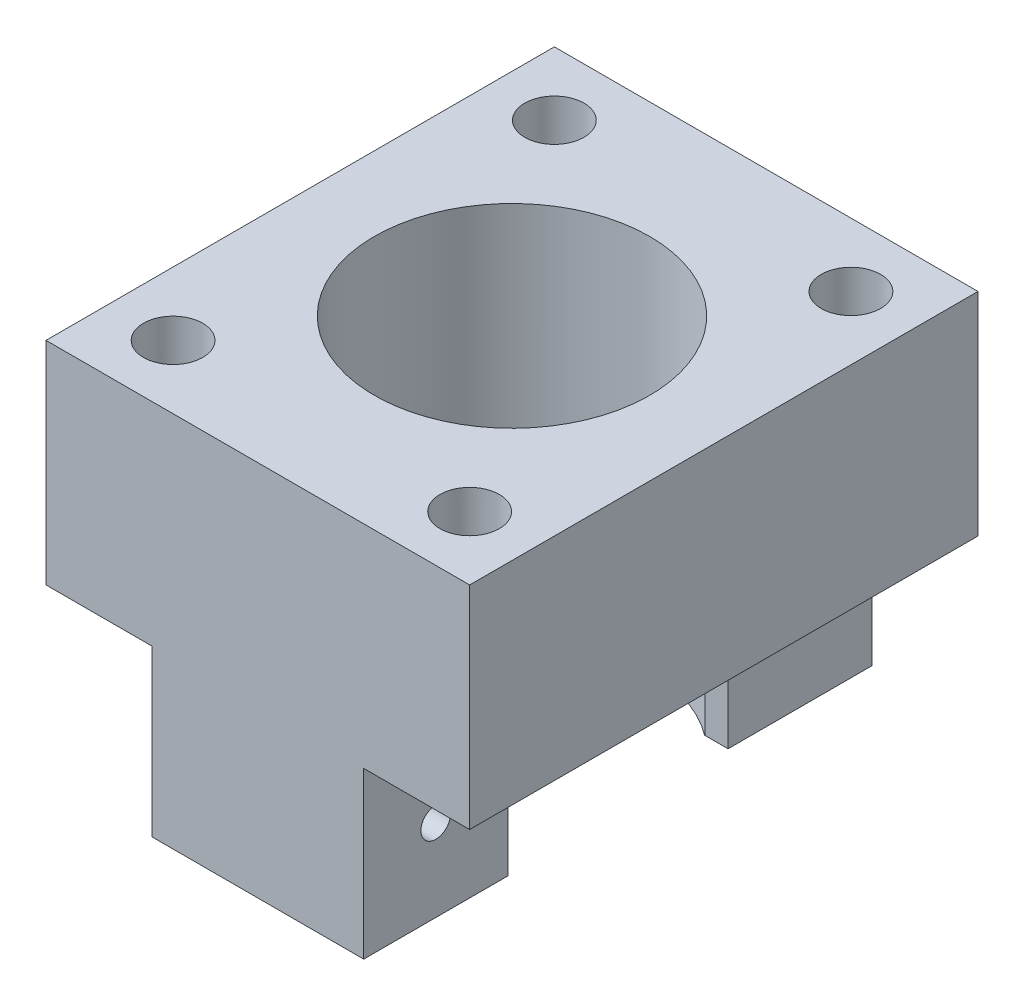
ISO-10303-21;
HEADER;
FILE_DESCRIPTION(('STEP AP214'),'2;1');
FILE_NAME('part.step','',(''),(''),'','','');
FILE_SCHEMA(('AUTOMOTIVE_DESIGN { 1 0 10303 214 1 1 1 1 }'));
ENDSEC;
DATA;
#1=APPLICATION_CONTEXT('core data for automotive mechanical design processes');
#2=APPLICATION_PROTOCOL_DEFINITION('international standard','automotive_design',2000,#1);
#3=PRODUCT_CONTEXT('',#1,'mechanical');
#4=PRODUCT('Part','Part','',(#3));
#5=PRODUCT_RELATED_PRODUCT_CATEGORY('part','',(#4));
#6=PRODUCT_DEFINITION_FORMATION('','',#4);
#7=PRODUCT_DEFINITION_CONTEXT('part definition',#1,'design');
#8=PRODUCT_DEFINITION('design','',#6,#7);
#9=PRODUCT_DEFINITION_SHAPE('','',#8);
#10=(LENGTH_UNIT() NAMED_UNIT(*) SI_UNIT(.MILLI.,.METRE.));
#11=(NAMED_UNIT(*) PLANE_ANGLE_UNIT() SI_UNIT($,.RADIAN.));
#12=(NAMED_UNIT(*) SI_UNIT($,.STERADIAN.) SOLID_ANGLE_UNIT());
#13=UNCERTAINTY_MEASURE_WITH_UNIT(LENGTH_MEASURE(1.E-05),#10,'distance_accuracy_value','');
#14=(GEOMETRIC_REPRESENTATION_CONTEXT(3) GLOBAL_UNCERTAINTY_ASSIGNED_CONTEXT((#13)) GLOBAL_UNIT_ASSIGNED_CONTEXT((#10,
#11,#12)) REPRESENTATION_CONTEXT('',''));
#15=CARTESIAN_POINT('',(0.,0.,0.));
#16=DIRECTION('',(0.,0.,1.));
#17=DIRECTION('',(1.,0.,0.));
#18=AXIS2_PLACEMENT_3D('',#15,#16,#17);
#19=CARTESIAN_POINT('',(0.,0.,0.));
#20=DIRECTION('',(0.,1.,0.));
#21=DIRECTION('',(0.,0.,1.));
#22=AXIS2_PLACEMENT_3D('',#19,#20,#21);
#23=PLANE('',#22);
#24=DIRECTION('',(0.,0.,1.));
#25=VECTOR('',#24,1.);
#26=CARTESIAN_POINT('',(7.5,0.,0.));
#27=LINE('',#26,#25);
#28=CARTESIAN_POINT('',(7.5,0.,0.));
#29=VERTEX_POINT('',#28);
#30=CARTESIAN_POINT('',(7.5,0.,1.5));
#31=VERTEX_POINT('',#30);
#32=EDGE_CURVE('E379',#29,#31,#27,.T.);
#33=ORIENTED_EDGE('',*,*,#32,.F.);
#34=DIRECTION('',(-1.,0.,0.));
#35=VECTOR('',#34,1.);
#36=CARTESIAN_POINT('',(0.,0.,0.));
#37=LINE('',#36,#35);
#38=CARTESIAN_POINT('',(10.,0.,0.));
#39=VERTEX_POINT('',#38);
#40=EDGE_CURVE('E189',#39,#29,#37,.T.);
#41=ORIENTED_EDGE('',*,*,#40,.F.);
#42=DIRECTION('',(0.,0.,-1.));
#43=VECTOR('',#42,1.);
#44=CARTESIAN_POINT('',(10.,0.,0.));
#45=LINE('',#44,#43);
#46=CARTESIAN_POINT('',(10.,0.,12.));
#47=VERTEX_POINT('',#46);
#48=EDGE_CURVE('E292',#47,#39,#45,.T.);
#49=ORIENTED_EDGE('',*,*,#48,.F.);
#50=DIRECTION('',(1.,0.,0.));
#51=VECTOR('',#50,1.);
#52=CARTESIAN_POINT('',(0.,0.,12.));
#53=LINE('',#52,#51);
#54=CARTESIAN_POINT('',(7.5,0.,12.));
#55=VERTEX_POINT('',#54);
#56=EDGE_CURVE('E288',#55,#47,#53,.T.);
#57=ORIENTED_EDGE('',*,*,#56,.F.);
#58=DIRECTION('',(0.,0.,-1.));
#59=VECTOR('',#58,1.);
#60=CARTESIAN_POINT('',(7.5,0.,0.));
#61=LINE('',#60,#59);
#62=CARTESIAN_POINT('',(7.5,0.,10.5));
#63=VERTEX_POINT('',#62);
#64=EDGE_CURVE('E46',#55,#63,#61,.T.);
#65=ORIENTED_EDGE('',*,*,#64,.T.);
#66=CARTESIAN_POINT('',(8.5,0.,10.5));
#67=DIRECTION('',(0.,-1.,0.));
#68=DIRECTION('',(0.,0.,-1.));
#69=AXIS2_PLACEMENT_3D('',#66,#67,#68);
#70=CIRCLE('',#69,1.);
#71=EDGE_CURVE('E235',#63,#63,#70,.T.);
#72=ORIENTED_EDGE('',*,*,#71,.F.);
#73=CARTESIAN_POINT('',(7.5,0.,8.6));
#74=VERTEX_POINT('',#73);
#75=EDGE_CURVE('E12',#63,#74,#61,.T.);
#76=ORIENTED_EDGE('',*,*,#75,.T.);
#77=DIRECTION('',(1.,0.,0.));
#78=VECTOR('',#77,1.);
#79=CARTESIAN_POINT('',(0.,0.,8.6));
#80=LINE('',#79,#78);
#81=CARTESIAN_POINT('',(6.95,0.,8.6));
#82=VERTEX_POINT('',#81);
#83=EDGE_CURVE('E200',#82,#74,#80,.T.);
#84=ORIENTED_EDGE('',*,*,#83,.F.);
#85=CARTESIAN_POINT('',(5.,0.,6.));
#86=DIRECTION('',(0.,-1.,0.));
#87=DIRECTION('',(0.,0.,-1.));
#88=AXIS2_PLACEMENT_3D('',#85,#86,#87);
#89=CIRCLE('',#88,3.25);
#90=CARTESIAN_POINT('',(6.95000000000009,0.,3.40000000000007));
#91=VERTEX_POINT('',#90);
#92=EDGE_CURVE('E263',#91,#82,#89,.T.);
#93=ORIENTED_EDGE('',*,*,#92,.F.);
#94=DIRECTION('',(1.,0.,0.));
#95=VECTOR('',#94,1.);
#96=CARTESIAN_POINT('',(2.2291196666302E-13,0.,3.39999999999989));
#97=LINE('',#96,#95);
#98=CARTESIAN_POINT('',(7.5,0.,3.39999999999989));
#99=VERTEX_POINT('',#98);
#100=EDGE_CURVE('E53',#91,#99,#97,.T.);
#101=ORIENTED_EDGE('',*,*,#100,.T.);
#102=EDGE_CURVE('E381',#31,#99,#27,.T.);
#103=ORIENTED_EDGE('',*,*,#102,.F.);
#104=CARTESIAN_POINT('',(8.5,0.,1.5));
#105=DIRECTION('',(0.,-1.,0.));
#106=DIRECTION('',(0.,0.,-1.));
#107=AXIS2_PLACEMENT_3D('',#104,#105,#106);
#108=CIRCLE('',#107,1.);
#109=EDGE_CURVE('E236',#31,#31,#108,.T.);
#110=ORIENTED_EDGE('',*,*,#109,.F.);
#111=EDGE_LOOP('',(#33,#41,#49,#57,#65,#72,#76,#84,#93,#101,#103,#110));
#112=FACE_BOUND('',#111,.T.);
#113=ADVANCED_FACE('F35',(#112),#23,.F.);
#114=CARTESIAN_POINT('',(0.,5.,0.));
#115=DIRECTION('',(1.,0.,0.));
#116=DIRECTION('',(0.,0.,-1.));
#117=AXIS2_PLACEMENT_3D('',#114,#115,#116);
#118=PLANE('',#117);
#119=DIRECTION('',(0.,0.,1.));
#120=VECTOR('',#119,1.);
#121=CARTESIAN_POINT('',(0.,0.,0.));
#122=LINE('',#121,#120);
#123=CARTESIAN_POINT('',(0.,0.,0.));
#124=VERTEX_POINT('',#123);
#125=CARTESIAN_POINT('',(0.,0.,12.));
#126=VERTEX_POINT('',#125);
#127=EDGE_CURVE('E275',#124,#126,#122,.T.);
#128=ORIENTED_EDGE('',*,*,#127,.T.);
#129=DIRECTION('',(0.,-1.,0.));
#130=VECTOR('',#129,1.);
#131=CARTESIAN_POINT('',(0.,5.,12.));
#132=LINE('',#131,#130);
#133=CARTESIAN_POINT('',(0.,5.,12.));
#134=VERTEX_POINT('',#133);
#135=EDGE_CURVE('E303',#134,#126,#132,.T.);
#136=ORIENTED_EDGE('',*,*,#135,.F.);
#137=DIRECTION('',(0.,0.,1.));
#138=VECTOR('',#137,1.);
#139=CARTESIAN_POINT('',(0.,5.,0.));
#140=LINE('',#139,#138);
#141=CARTESIAN_POINT('',(0.,5.,0.));
#142=VERTEX_POINT('',#141);
#143=EDGE_CURVE('E276',#142,#134,#140,.T.);
#144=ORIENTED_EDGE('',*,*,#143,.F.);
#145=DIRECTION('',(0.,-1.,0.));
#146=VECTOR('',#145,1.);
#147=CARTESIAN_POINT('',(0.,5.,0.));
#148=LINE('',#147,#146);
#149=EDGE_CURVE('E285',#142,#124,#148,.T.);
#150=ORIENTED_EDGE('',*,*,#149,.T.);
#151=EDGE_LOOP('',(#128,#136,#144,#150));
#152=FACE_BOUND('',#151,.T.);
#153=ADVANCED_FACE('F37',(#152),#118,.F.);
#154=CARTESIAN_POINT('',(0.,5.,12.));
#155=DIRECTION('',(0.,0.,-1.));
#156=DIRECTION('',(-1.,0.,0.));
#157=AXIS2_PLACEMENT_3D('',#154,#155,#156);
#158=PLANE('',#157);
#159=CARTESIAN_POINT('',(2.50000000000004,0.,12.));
#160=VERTEX_POINT('',#159);
#161=EDGE_CURVE('E289',#126,#160,#53,.T.);
#162=ORIENTED_EDGE('',*,*,#161,.T.);
#163=DIRECTION('',(0.,1.,0.));
#164=VECTOR('',#163,1.);
#165=CARTESIAN_POINT('',(2.50000000000004,-3.9,12.));
#166=LINE('',#165,#164);
#167=CARTESIAN_POINT('',(2.50000000000004,-3.9,12.));
#168=VERTEX_POINT('',#167);
#169=EDGE_CURVE('E225',#168,#160,#166,.T.);
#170=ORIENTED_EDGE('',*,*,#169,.F.);
#171=DIRECTION('',(-1.,0.,0.));
#172=VECTOR('',#171,1.);
#173=CARTESIAN_POINT('',(0.,-3.9,12.));
#174=LINE('',#173,#172);
#175=CARTESIAN_POINT('',(7.5,-3.9,12.));
#176=VERTEX_POINT('',#175);
#177=EDGE_CURVE('E199',#176,#168,#174,.T.);
#178=ORIENTED_EDGE('',*,*,#177,.F.);
#179=DIRECTION('',(0.,1.,0.));
#180=VECTOR('',#179,1.);
#181=CARTESIAN_POINT('',(7.5,-3.9,12.));
#182=LINE('',#181,#180);
#183=EDGE_CURVE('E228',#176,#55,#182,.T.);
#184=ORIENTED_EDGE('',*,*,#183,.T.);
#185=ORIENTED_EDGE('',*,*,#56,.T.);
#186=DIRECTION('',(0.,-1.,0.));
#187=VECTOR('',#186,1.);
#188=CARTESIAN_POINT('',(10.,5.,12.));
#189=LINE('',#188,#187);
#190=CARTESIAN_POINT('',(10.,5.,12.));
#191=VERTEX_POINT('',#190);
#192=EDGE_CURVE('E300',#191,#47,#189,.T.);
#193=ORIENTED_EDGE('',*,*,#192,.F.);
#194=DIRECTION('',(1.,0.,0.));
#195=VECTOR('',#194,1.);
#196=CARTESIAN_POINT('',(0.,5.,12.));
#197=LINE('',#196,#195);
#198=EDGE_CURVE('E279',#134,#191,#197,.T.);
#199=ORIENTED_EDGE('',*,*,#198,.F.);
#200=ORIENTED_EDGE('',*,*,#135,.T.);
#201=EDGE_LOOP('',(#162,#170,#178,#184,#185,#193,#199,#200));
#202=FACE_BOUND('',#201,.T.);
#203=ADVANCED_FACE('F349',(#202),#158,.F.);
#204=CARTESIAN_POINT('',(10.,5.,0.));
#205=DIRECTION('',(-1.,0.,0.));
#206=DIRECTION('',(0.,0.,1.));
#207=AXIS2_PLACEMENT_3D('',#204,#205,#206);
#208=PLANE('',#207);
#209=ORIENTED_EDGE('',*,*,#48,.T.);
#210=DIRECTION('',(0.,-1.,0.));
#211=VECTOR('',#210,1.);
#212=CARTESIAN_POINT('',(10.,5.,0.));
#213=LINE('',#212,#211);
#214=CARTESIAN_POINT('',(10.,5.,0.));
#215=VERTEX_POINT('',#214);
#216=EDGE_CURVE('E298',#215,#39,#213,.T.);
#217=ORIENTED_EDGE('',*,*,#216,.F.);
#218=DIRECTION('',(0.,0.,-1.));
#219=VECTOR('',#218,1.);
#220=CARTESIAN_POINT('',(10.,5.,0.));
#221=LINE('',#220,#219);
#222=EDGE_CURVE('E281',#191,#215,#221,.T.);
#223=ORIENTED_EDGE('',*,*,#222,.F.);
#224=ORIENTED_EDGE('',*,*,#192,.T.);
#225=EDGE_LOOP('',(#209,#217,#223,#224));
#226=FACE_BOUND('',#225,.T.);
#227=ADVANCED_FACE('F432',(#226),#208,.F.);
#228=CARTESIAN_POINT('',(0.,5.,0.));
#229=DIRECTION('',(0.,0.,1.));
#230=DIRECTION('',(1.,0.,0.));
#231=AXIS2_PLACEMENT_3D('',#228,#229,#230);
#232=PLANE('',#231);
#233=ORIENTED_EDGE('',*,*,#40,.T.);
#234=DIRECTION('',(0.,1.,0.));
#235=VECTOR('',#234,1.);
#236=CARTESIAN_POINT('',(7.5,-3.9,0.));
#237=LINE('',#236,#235);
#238=CARTESIAN_POINT('',(7.5,-3.9,0.));
#239=VERTEX_POINT('',#238);
#240=EDGE_CURVE('E167',#239,#29,#237,.T.);
#241=ORIENTED_EDGE('',*,*,#240,.F.);
#242=DIRECTION('',(1.,0.,0.));
#243=VECTOR('',#242,1.);
#244=CARTESIAN_POINT('',(0.,-3.9,0.));
#245=LINE('',#244,#243);
#246=CARTESIAN_POINT('',(2.5,-3.9,-2.2291196666302E-13));
#247=VERTEX_POINT('',#246);
#248=EDGE_CURVE('E174',#247,#239,#245,.T.);
#249=ORIENTED_EDGE('',*,*,#248,.F.);
#250=DIRECTION('',(0.,1.,0.));
#251=VECTOR('',#250,1.);
#252=CARTESIAN_POINT('',(2.5,-3.9,-2.2291196666302E-13));
#253=LINE('',#252,#251);
#254=CARTESIAN_POINT('',(2.5,0.,-2.2291196666302E-13));
#255=VERTEX_POINT('',#254);
#256=EDGE_CURVE('E361',#247,#255,#253,.T.);
#257=ORIENTED_EDGE('',*,*,#256,.T.);
#258=EDGE_CURVE('E294',#255,#124,#37,.T.);
#259=ORIENTED_EDGE('',*,*,#258,.T.);
#260=ORIENTED_EDGE('',*,*,#149,.F.);
#261=DIRECTION('',(-1.,0.,0.));
#262=VECTOR('',#261,1.);
#263=CARTESIAN_POINT('',(0.,5.,0.));
#264=LINE('',#263,#262);
#265=EDGE_CURVE('E283',#215,#142,#264,.T.);
#266=ORIENTED_EDGE('',*,*,#265,.F.);
#267=ORIENTED_EDGE('',*,*,#216,.T.);
#268=EDGE_LOOP('',(#233,#241,#249,#257,#259,#260,#266,#267));
#269=FACE_BOUND('',#268,.T.);
#270=ADVANCED_FACE('F186',(#269),#232,.F.);
#271=CARTESIAN_POINT('',(0.,5.,0.));
#272=DIRECTION('',(0.,1.,0.));
#273=DIRECTION('',(0.,0.,1.));
#274=AXIS2_PLACEMENT_3D('',#271,#272,#273);
#275=PLANE('',#274);
#276=CARTESIAN_POINT('',(5.,5.,6.));
#277=DIRECTION('',(0.,-1.,0.));
#278=DIRECTION('',(0.,0.,-1.));
#279=AXIS2_PLACEMENT_3D('',#276,#277,#278);
#280=CIRCLE('',#279,3.25);
#281=CARTESIAN_POINT('',(5.,5.,2.75));
#282=VERTEX_POINT('',#281);
#283=EDGE_CURVE('E256',#282,#282,#280,.T.);
#284=ORIENTED_EDGE('',*,*,#283,.T.);
#285=EDGE_LOOP('',(#284));
#286=FACE_BOUND('',#285,.T.);
#287=CARTESIAN_POINT('',(1.5,5.,10.5));
#288=DIRECTION('',(0.,-1.,0.));
#289=DIRECTION('',(0.,0.,-1.));
#290=AXIS2_PLACEMENT_3D('',#287,#288,#289);
#291=CIRCLE('',#290,0.7);
#292=CARTESIAN_POINT('',(1.5,5.,9.8));
#293=VERTEX_POINT('',#292);
#294=EDGE_CURVE('E259',#293,#293,#291,.T.);
#295=ORIENTED_EDGE('',*,*,#294,.T.);
#296=EDGE_LOOP('',(#295));
#297=FACE_BOUND('',#296,.T.);
#298=CARTESIAN_POINT('',(8.5,5.,10.5));
#299=DIRECTION('',(0.,-1.,0.));
#300=DIRECTION('',(0.,0.,-1.));
#301=AXIS2_PLACEMENT_3D('',#298,#299,#300);
#302=CIRCLE('',#301,0.699999999999999);
#303=CARTESIAN_POINT('',(8.5,5.,9.8));
#304=VERTEX_POINT('',#303);
#305=EDGE_CURVE('E268',#304,#304,#302,.T.);
#306=ORIENTED_EDGE('',*,*,#305,.T.);
#307=EDGE_LOOP('',(#306));
#308=FACE_BOUND('',#307,.T.);
#309=CARTESIAN_POINT('',(8.5,5.,1.5));
#310=DIRECTION('',(0.,-1.,0.));
#311=DIRECTION('',(0.,0.,-1.));
#312=AXIS2_PLACEMENT_3D('',#309,#310,#311);
#313=CIRCLE('',#312,0.700000000000001);
#314=CARTESIAN_POINT('',(8.5,5.,0.799999999999997));
#315=VERTEX_POINT('',#314);
#316=EDGE_CURVE('E264',#315,#315,#313,.T.);
#317=ORIENTED_EDGE('',*,*,#316,.T.);
#318=EDGE_LOOP('',(#317));
#319=FACE_BOUND('',#318,.T.);
#320=CARTESIAN_POINT('',(1.5,5.,1.5));
#321=DIRECTION('',(0.,-1.,0.));
#322=DIRECTION('',(0.,0.,-1.));
#323=AXIS2_PLACEMENT_3D('',#320,#321,#322);
#324=CIRCLE('',#323,0.700000000000002);
#325=CARTESIAN_POINT('',(1.5,5.,0.799999999999996));
#326=VERTEX_POINT('',#325);
#327=EDGE_CURVE('E267',#326,#326,#324,.T.);
#328=ORIENTED_EDGE('',*,*,#327,.T.);
#329=EDGE_LOOP('',(#328));
#330=FACE_BOUND('',#329,.T.);
#331=ORIENTED_EDGE('',*,*,#143,.T.);
#332=ORIENTED_EDGE('',*,*,#198,.T.);
#333=ORIENTED_EDGE('',*,*,#222,.T.);
#334=ORIENTED_EDGE('',*,*,#265,.T.);
#335=EDGE_LOOP('',(#331,#332,#333,#334));
#336=FACE_BOUND('',#335,.T.);
#337=ADVANCED_FACE('F421',(#286,#297,#308,#319,#330,#336),#275,.T.);
#338=DIRECTION('',(0.,0.,1.));
#339=VECTOR('',#338,1.);
#340=CARTESIAN_POINT('',(2.5,0.,-2.22044604925031E-13));
#341=LINE('',#340,#339);
#342=CARTESIAN_POINT('',(2.5,0.,1.5));
#343=VERTEX_POINT('',#342);
#344=CARTESIAN_POINT('',(2.5,0.,3.4));
#345=VERTEX_POINT('',#344);
#346=EDGE_CURVE('E366',#343,#345,#341,.T.);
#347=ORIENTED_EDGE('',*,*,#346,.T.);
#348=CARTESIAN_POINT('',(3.05,0.,3.4));
#349=VERTEX_POINT('',#348);
#350=EDGE_CURVE('E368',#345,#349,#97,.T.);
#351=ORIENTED_EDGE('',*,*,#350,.T.);
#352=CARTESIAN_POINT('',(3.05,0.,8.6));
#353=VERTEX_POINT('',#352);
#354=EDGE_CURVE('E260',#353,#349,#89,.T.);
#355=ORIENTED_EDGE('',*,*,#354,.F.);
#356=CARTESIAN_POINT('',(2.50000000000004,0.,8.6));
#357=VERTEX_POINT('',#356);
#358=EDGE_CURVE('E211',#357,#353,#80,.T.);
#359=ORIENTED_EDGE('',*,*,#358,.F.);
#360=DIRECTION('',(0.,0.,-1.));
#361=VECTOR('',#360,1.);
#362=CARTESIAN_POINT('',(2.5,0.,0.));
#363=LINE('',#362,#361);
#364=CARTESIAN_POINT('',(2.5,0.,10.5));
#365=VERTEX_POINT('',#364);
#366=EDGE_CURVE('E44',#365,#357,#363,.T.);
#367=ORIENTED_EDGE('',*,*,#366,.F.);
#368=CARTESIAN_POINT('',(1.5,0.,10.5));
#369=DIRECTION('',(0.,-1.,0.));
#370=DIRECTION('',(0.,0.,-1.));
#371=AXIS2_PLACEMENT_3D('',#368,#369,#370);
#372=CIRCLE('',#371,1.);
#373=EDGE_CURVE('E239',#365,#365,#372,.T.);
#374=ORIENTED_EDGE('',*,*,#373,.F.);
#375=EDGE_CURVE('E191',#160,#365,#363,.T.);
#376=ORIENTED_EDGE('',*,*,#375,.F.);
#377=ORIENTED_EDGE('',*,*,#161,.F.);
#378=ORIENTED_EDGE('',*,*,#127,.F.);
#379=ORIENTED_EDGE('',*,*,#258,.F.);
#380=EDGE_CURVE('E183',#255,#343,#341,.T.);
#381=ORIENTED_EDGE('',*,*,#380,.T.);
#382=CARTESIAN_POINT('',(1.5,0.,1.5));
#383=DIRECTION('',(0.,-1.,0.));
#384=DIRECTION('',(0.,0.,-1.));
#385=AXIS2_PLACEMENT_3D('',#382,#383,#384);
#386=CIRCLE('',#385,1.);
#387=EDGE_CURVE('E243',#343,#343,#386,.T.);
#388=ORIENTED_EDGE('',*,*,#387,.F.);
#389=EDGE_LOOP('',(#347,#351,#355,#359,#367,#374,#376,#377,#378,#379,#381,#388));
#390=FACE_BOUND('',#389,.T.);
#391=ADVANCED_FACE('F340',(#390),#23,.F.);
#392=CARTESIAN_POINT('',(1.5,5.,1.5));
#393=DIRECTION('',(0.,-1.,0.));
#394=DIRECTION('',(0.,0.,-1.));
#395=AXIS2_PLACEMENT_3D('',#392,#393,#394);
#396=CYLINDRICAL_SURFACE('',#395,0.700000000000002);
#397=CARTESIAN_POINT('',(1.5,3.,1.5));
#398=DIRECTION('',(0.,1.,0.));
#399=DIRECTION('',(0.,0.,1.));
#400=AXIS2_PLACEMENT_3D('',#397,#398,#399);
#401=CIRCLE('',#400,0.700000000000002);
#402=CARTESIAN_POINT('',(1.5,3.,2.2));
#403=VERTEX_POINT('',#402);
#404=EDGE_CURVE('E39',#403,#403,#401,.F.);
#405=ORIENTED_EDGE('',*,*,#404,.T.);
#406=EDGE_LOOP('',(#405));
#407=FACE_BOUND('',#406,.T.);
#408=ORIENTED_EDGE('',*,*,#327,.F.);
#409=EDGE_LOOP('',(#408));
#410=FACE_BOUND('',#409,.T.);
#411=ADVANCED_FACE('F420',(#407,#410),#396,.F.);
#412=CARTESIAN_POINT('',(8.5,5.,1.5));
#413=DIRECTION('',(0.,-1.,0.));
#414=DIRECTION('',(0.,0.,-1.));
#415=AXIS2_PLACEMENT_3D('',#412,#413,#414);
#416=CYLINDRICAL_SURFACE('',#415,0.700000000000001);
#417=CARTESIAN_POINT('',(8.5,3.,1.5));
#418=DIRECTION('',(0.,1.,0.));
#419=DIRECTION('',(0.,0.,1.));
#420=AXIS2_PLACEMENT_3D('',#417,#418,#419);
#421=CIRCLE('',#420,0.700000000000001);
#422=CARTESIAN_POINT('',(8.5,3.,2.2));
#423=VERTEX_POINT('',#422);
#424=EDGE_CURVE('E310',#423,#423,#421,.F.);
#425=ORIENTED_EDGE('',*,*,#424,.T.);
#426=EDGE_LOOP('',(#425));
#427=FACE_BOUND('',#426,.T.);
#428=ORIENTED_EDGE('',*,*,#316,.F.);
#429=EDGE_LOOP('',(#428));
#430=FACE_BOUND('',#429,.T.);
#431=ADVANCED_FACE('F426',(#427,#430),#416,.F.);
#432=CARTESIAN_POINT('',(8.5,5.,10.5));
#433=DIRECTION('',(0.,-1.,0.));
#434=DIRECTION('',(0.,0.,-1.));
#435=AXIS2_PLACEMENT_3D('',#432,#433,#434);
#436=CYLINDRICAL_SURFACE('',#435,0.699999999999999);
#437=CARTESIAN_POINT('',(8.5,3.,10.5));
#438=DIRECTION('',(0.,1.,0.));
#439=DIRECTION('',(0.,0.,1.));
#440=AXIS2_PLACEMENT_3D('',#437,#438,#439);
#441=CIRCLE('',#440,0.699999999999999);
#442=CARTESIAN_POINT('',(8.5,3.,11.2));
#443=VERTEX_POINT('',#442);
#444=EDGE_CURVE('E308',#443,#443,#441,.F.);
#445=ORIENTED_EDGE('',*,*,#444,.T.);
#446=EDGE_LOOP('',(#445));
#447=FACE_BOUND('',#446,.T.);
#448=ORIENTED_EDGE('',*,*,#305,.F.);
#449=EDGE_LOOP('',(#448));
#450=FACE_BOUND('',#449,.T.);
#451=ADVANCED_FACE('F438',(#447,#450),#436,.F.);
#452=CARTESIAN_POINT('',(1.5,5.,10.5));
#453=DIRECTION('',(0.,-1.,0.));
#454=DIRECTION('',(0.,0.,-1.));
#455=AXIS2_PLACEMENT_3D('',#452,#453,#454);
#456=CYLINDRICAL_SURFACE('',#455,0.7);
#457=CARTESIAN_POINT('',(1.5,3.,10.5));
#458=DIRECTION('',(0.,1.,0.));
#459=DIRECTION('',(0.,0.,1.));
#460=AXIS2_PLACEMENT_3D('',#457,#458,#459);
#461=CIRCLE('',#460,0.7);
#462=CARTESIAN_POINT('',(1.5,3.,11.2));
#463=VERTEX_POINT('',#462);
#464=EDGE_CURVE('E255',#463,#463,#461,.F.);
#465=ORIENTED_EDGE('',*,*,#464,.T.);
#466=EDGE_LOOP('',(#465));
#467=FACE_BOUND('',#466,.T.);
#468=ORIENTED_EDGE('',*,*,#294,.F.);
#469=EDGE_LOOP('',(#468));
#470=FACE_BOUND('',#469,.T.);
#471=ADVANCED_FACE('F435',(#467,#470),#456,.F.);
#472=CARTESIAN_POINT('',(5.,5.,6.));
#473=DIRECTION('',(0.,-1.,0.));
#474=DIRECTION('',(0.,0.,-1.));
#475=AXIS2_PLACEMENT_3D('',#472,#473,#474);
#476=CYLINDRICAL_SURFACE('',#475,3.25);
#477=ORIENTED_EDGE('',*,*,#283,.F.);
#478=EDGE_LOOP('',(#477));
#479=FACE_BOUND('',#478,.T.);
#480=ORIENTED_EDGE('',*,*,#354,.T.);
#481=DIRECTION('',(0.,1.,0.));
#482=VECTOR('',#481,1.);
#483=CARTESIAN_POINT('',(3.05,-3.9,3.4));
#484=LINE('',#483,#482);
#485=CARTESIAN_POINT('',(3.05,-3.9,3.4));
#486=VERTEX_POINT('',#485);
#487=EDGE_CURVE('E373',#486,#349,#484,.T.);
#488=ORIENTED_EDGE('',*,*,#487,.F.);
#489=CARTESIAN_POINT('',(5.,-3.9,6.));
#490=DIRECTION('',(0.,-1.,0.));
#491=DIRECTION('',(0.,0.,-1.));
#492=AXIS2_PLACEMENT_3D('',#489,#490,#491);
#493=CIRCLE('',#492,3.25);
#494=CARTESIAN_POINT('',(6.95000000000022,-3.9,3.39999999999989));
#495=VERTEX_POINT('',#494);
#496=EDGE_CURVE('E385',#495,#486,#493,.F.);
#497=ORIENTED_EDGE('',*,*,#496,.F.);
#498=DIRECTION('',(0.,1.,0.));
#499=VECTOR('',#498,1.);
#500=CARTESIAN_POINT('',(6.95000000000022,-3.9,3.39999999999989));
#501=LINE('',#500,#499);
#502=EDGE_CURVE('E192',#495,#91,#501,.T.);
#503=ORIENTED_EDGE('',*,*,#502,.T.);
#504=ORIENTED_EDGE('',*,*,#92,.T.);
#505=DIRECTION('',(0.,1.,0.));
#506=VECTOR('',#505,1.);
#507=CARTESIAN_POINT('',(6.95,-3.9,8.59999999999985));
#508=LINE('',#507,#506);
#509=CARTESIAN_POINT('',(6.95,-3.9,8.59999999999985));
#510=VERTEX_POINT('',#509);
#511=EDGE_CURVE('E216',#510,#82,#508,.T.);
#512=ORIENTED_EDGE('',*,*,#511,.F.);
#513=CARTESIAN_POINT('',(5.,-3.9,6.));
#514=DIRECTION('',(0.,-1.,0.));
#515=DIRECTION('',(0.,0.,-1.));
#516=AXIS2_PLACEMENT_3D('',#513,#514,#515);
#517=CIRCLE('',#516,3.25);
#518=CARTESIAN_POINT('',(3.05,-3.9,8.6));
#519=VERTEX_POINT('',#518);
#520=EDGE_CURVE('E206',#519,#510,#517,.F.);
#521=ORIENTED_EDGE('',*,*,#520,.F.);
#522=DIRECTION('',(0.,1.,0.));
#523=VECTOR('',#522,1.);
#524=CARTESIAN_POINT('',(3.05,-3.9,8.6));
#525=LINE('',#524,#523);
#526=EDGE_CURVE('E219',#519,#353,#525,.T.);
#527=ORIENTED_EDGE('',*,*,#526,.T.);
#528=EDGE_LOOP('',(#480,#488,#497,#503,#504,#512,#521,#527));
#529=FACE_BOUND('',#528,.T.);
#530=ADVANCED_FACE('F320',(#479,#529),#476,.F.);
#531=CARTESIAN_POINT('',(0.,3.,0.));
#532=DIRECTION('',(0.,1.,0.));
#533=DIRECTION('',(0.,0.,1.));
#534=AXIS2_PLACEMENT_3D('',#531,#532,#533);
#535=PLANE('',#534);
#536=CARTESIAN_POINT('',(1.5,3.,10.5));
#537=DIRECTION('',(0.,1.,0.));
#538=DIRECTION('',(0.,0.,1.));
#539=AXIS2_PLACEMENT_3D('',#536,#537,#538);
#540=CIRCLE('',#539,1.);
#541=CARTESIAN_POINT('',(1.5,3.,11.5));
#542=VERTEX_POINT('',#541);
#543=EDGE_CURVE('E252',#542,#542,#540,.F.);
#544=ORIENTED_EDGE('',*,*,#543,.T.);
#545=EDGE_LOOP('',(#544));
#546=FACE_BOUND('',#545,.T.);
#547=ORIENTED_EDGE('',*,*,#464,.F.);
#548=EDGE_LOOP('',(#547));
#549=FACE_BOUND('',#548,.T.);
#550=ADVANCED_FACE('F447',(#546,#549),#535,.F.);
#551=CARTESIAN_POINT('',(1.5,7.8284271247462,10.5));
#552=DIRECTION('',(0.,-1.,0.));
#553=DIRECTION('',(0.,0.,-1.));
#554=AXIS2_PLACEMENT_3D('',#551,#552,#553);
#555=CYLINDRICAL_SURFACE('',#554,1.);
#556=ORIENTED_EDGE('',*,*,#373,.T.);
#557=EDGE_LOOP('',(#556));
#558=FACE_BOUND('',#557,.T.);
#559=ORIENTED_EDGE('',*,*,#543,.F.);
#560=EDGE_LOOP('',(#559));
#561=FACE_BOUND('',#560,.T.);
#562=ADVANCED_FACE('F451',(#558,#561),#555,.F.);
#563=CARTESIAN_POINT('',(0.,3.,0.));
#564=DIRECTION('',(0.,1.,0.));
#565=DIRECTION('',(0.,0.,1.));
#566=AXIS2_PLACEMENT_3D('',#563,#564,#565);
#567=PLANE('',#566);
#568=CARTESIAN_POINT('',(8.5,3.,10.5));
#569=DIRECTION('',(0.,1.,0.));
#570=DIRECTION('',(0.,0.,1.));
#571=AXIS2_PLACEMENT_3D('',#568,#569,#570);
#572=CIRCLE('',#571,1.);
#573=CARTESIAN_POINT('',(8.5,3.,11.5));
#574=VERTEX_POINT('',#573);
#575=EDGE_CURVE('E232',#574,#574,#572,.F.);
#576=ORIENTED_EDGE('',*,*,#575,.T.);
#577=EDGE_LOOP('',(#576));
#578=FACE_BOUND('',#577,.T.);
#579=ORIENTED_EDGE('',*,*,#444,.F.);
#580=EDGE_LOOP('',(#579));
#581=FACE_BOUND('',#580,.T.);
#582=ADVANCED_FACE('F455',(#578,#581),#567,.F.);
#583=CARTESIAN_POINT('',(8.5,7.8284271247462,10.5));
#584=DIRECTION('',(0.,-1.,0.));
#585=DIRECTION('',(0.,0.,-1.));
#586=AXIS2_PLACEMENT_3D('',#583,#584,#585);
#587=CYLINDRICAL_SURFACE('',#586,1.);
#588=ORIENTED_EDGE('',*,*,#71,.T.);
#589=EDGE_LOOP('',(#588));
#590=FACE_BOUND('',#589,.T.);
#591=ORIENTED_EDGE('',*,*,#575,.F.);
#592=EDGE_LOOP('',(#591));
#593=FACE_BOUND('',#592,.T.);
#594=ADVANCED_FACE('F473',(#590,#593),#587,.F.);
#595=CARTESIAN_POINT('',(0.,3.,0.));
#596=DIRECTION('',(0.,1.,0.));
#597=DIRECTION('',(0.,0.,1.));
#598=AXIS2_PLACEMENT_3D('',#595,#596,#597);
#599=PLANE('',#598);
#600=CARTESIAN_POINT('',(8.5,3.,1.5));
#601=DIRECTION('',(0.,1.,0.));
#602=DIRECTION('',(0.,0.,1.));
#603=AXIS2_PLACEMENT_3D('',#600,#601,#602);
#604=CIRCLE('',#603,1.);
#605=CARTESIAN_POINT('',(8.5,3.,2.5));
#606=VERTEX_POINT('',#605);
#607=EDGE_CURVE('E240',#606,#606,#604,.F.);
#608=ORIENTED_EDGE('',*,*,#607,.T.);
#609=EDGE_LOOP('',(#608));
#610=FACE_BOUND('',#609,.T.);
#611=ORIENTED_EDGE('',*,*,#424,.F.);
#612=EDGE_LOOP('',(#611));
#613=FACE_BOUND('',#612,.T.);
#614=ADVANCED_FACE('F469',(#610,#613),#599,.F.);
#615=CARTESIAN_POINT('',(8.5,7.8284271247462,1.5));
#616=DIRECTION('',(0.,-1.,0.));
#617=DIRECTION('',(0.,0.,-1.));
#618=AXIS2_PLACEMENT_3D('',#615,#616,#617);
#619=CYLINDRICAL_SURFACE('',#618,1.);
#620=ORIENTED_EDGE('',*,*,#109,.T.);
#621=EDGE_LOOP('',(#620));
#622=FACE_BOUND('',#621,.T.);
#623=ORIENTED_EDGE('',*,*,#607,.F.);
#624=EDGE_LOOP('',(#623));
#625=FACE_BOUND('',#624,.T.);
#626=ADVANCED_FACE('F465',(#622,#625),#619,.F.);
#627=CARTESIAN_POINT('',(0.,3.,0.));
#628=DIRECTION('',(0.,1.,0.));
#629=DIRECTION('',(0.,0.,1.));
#630=AXIS2_PLACEMENT_3D('',#627,#628,#629);
#631=PLANE('',#630);
#632=CARTESIAN_POINT('',(1.5,3.,1.5));
#633=DIRECTION('',(0.,1.,0.));
#634=DIRECTION('',(0.,0.,1.));
#635=AXIS2_PLACEMENT_3D('',#632,#633,#634);
#636=CIRCLE('',#635,1.);
#637=CARTESIAN_POINT('',(1.5,3.,2.5));
#638=VERTEX_POINT('',#637);
#639=EDGE_CURVE('E231',#638,#638,#636,.F.);
#640=ORIENTED_EDGE('',*,*,#639,.T.);
#641=EDGE_LOOP('',(#640));
#642=FACE_BOUND('',#641,.T.);
#643=ORIENTED_EDGE('',*,*,#404,.F.);
#644=EDGE_LOOP('',(#643));
#645=FACE_BOUND('',#644,.T.);
#646=ADVANCED_FACE('F461',(#642,#645),#631,.F.);
#647=CARTESIAN_POINT('',(1.5,7.8284271247462,1.5));
#648=DIRECTION('',(0.,-1.,0.));
#649=DIRECTION('',(0.,0.,-1.));
#650=AXIS2_PLACEMENT_3D('',#647,#648,#649);
#651=CYLINDRICAL_SURFACE('',#650,1.);
#652=ORIENTED_EDGE('',*,*,#387,.T.);
#653=EDGE_LOOP('',(#652));
#654=FACE_BOUND('',#653,.T.);
#655=ORIENTED_EDGE('',*,*,#639,.F.);
#656=EDGE_LOOP('',(#655));
#657=FACE_BOUND('',#656,.T.);
#658=ADVANCED_FACE('F457',(#654,#657),#651,.F.);
#659=CARTESIAN_POINT('',(7.5,-3.9,0.));
#660=DIRECTION('',(1.,0.,0.));
#661=DIRECTION('',(0.,0.,-1.));
#662=AXIS2_PLACEMENT_3D('',#659,#660,#661);
#663=PLANE('',#662);
#664=CARTESIAN_POINT('',(7.5,-1.95,10.3));
#665=DIRECTION('',(1.,0.,0.));
#666=DIRECTION('',(0.,0.,-1.));
#667=AXIS2_PLACEMENT_3D('',#664,#665,#666);
#668=CIRCLE('',#667,0.349999999999999);
#669=CARTESIAN_POINT('',(7.5,-1.95,9.95));
#670=VERTEX_POINT('',#669);
#671=EDGE_CURVE('E382',#670,#670,#668,.T.);
#672=ORIENTED_EDGE('',*,*,#671,.F.);
#673=EDGE_LOOP('',(#672));
#674=FACE_BOUND('',#673,.T.);
#675=ORIENTED_EDGE('',*,*,#64,.F.);
#676=ORIENTED_EDGE('',*,*,#183,.F.);
#677=DIRECTION('',(0.,0.,-1.));
#678=VECTOR('',#677,1.);
#679=CARTESIAN_POINT('',(7.5,-3.9,0.));
#680=LINE('',#679,#678);
#681=CARTESIAN_POINT('',(7.5,-3.9,8.6));
#682=VERTEX_POINT('',#681);
#683=EDGE_CURVE('E196',#176,#682,#680,.T.);
#684=ORIENTED_EDGE('',*,*,#683,.T.);
#685=DIRECTION('',(0.,1.,0.));
#686=VECTOR('',#685,1.);
#687=CARTESIAN_POINT('',(7.5,-3.9,8.6));
#688=LINE('',#687,#686);
#689=EDGE_CURVE('E214',#682,#74,#688,.T.);
#690=ORIENTED_EDGE('',*,*,#689,.T.);
#691=ORIENTED_EDGE('',*,*,#75,.F.);
#692=EDGE_LOOP('',(#675,#676,#684,#690,#691));
#693=FACE_BOUND('',#692,.T.);
#694=ADVANCED_FACE('F460',(#674,#693),#663,.T.);
#695=CARTESIAN_POINT('',(2.5,-3.9,0.));
#696=DIRECTION('',(1.,0.,0.));
#697=DIRECTION('',(0.,0.,-1.));
#698=AXIS2_PLACEMENT_3D('',#695,#696,#697);
#699=PLANE('',#698);
#700=CARTESIAN_POINT('',(2.5,-1.95,10.3));
#701=DIRECTION('',(-1.,0.,0.));
#702=DIRECTION('',(0.,0.,1.));
#703=AXIS2_PLACEMENT_3D('',#700,#701,#702);
#704=CIRCLE('',#703,0.349999999999999);
#705=CARTESIAN_POINT('',(2.5,-1.95,10.65));
#706=VERTEX_POINT('',#705);
#707=EDGE_CURVE('E394',#706,#706,#704,.T.);
#708=ORIENTED_EDGE('',*,*,#707,.F.);
#709=EDGE_LOOP('',(#708));
#710=FACE_BOUND('',#709,.T.);
#711=ORIENTED_EDGE('',*,*,#375,.T.);
#712=ORIENTED_EDGE('',*,*,#366,.T.);
#713=DIRECTION('',(0.,1.,0.));
#714=VECTOR('',#713,1.);
#715=CARTESIAN_POINT('',(2.50000000000004,-3.9,8.6));
#716=LINE('',#715,#714);
#717=CARTESIAN_POINT('',(2.50000000000004,-3.9,8.6));
#718=VERTEX_POINT('',#717);
#719=EDGE_CURVE('E222',#718,#357,#716,.T.);
#720=ORIENTED_EDGE('',*,*,#719,.F.);
#721=DIRECTION('',(0.,0.,-1.));
#722=VECTOR('',#721,1.);
#723=CARTESIAN_POINT('',(2.5,-3.9,0.));
#724=LINE('',#723,#722);
#725=EDGE_CURVE('E202',#168,#718,#724,.T.);
#726=ORIENTED_EDGE('',*,*,#725,.F.);
#727=ORIENTED_EDGE('',*,*,#169,.T.);
#728=EDGE_LOOP('',(#711,#712,#720,#726,#727));
#729=FACE_BOUND('',#728,.T.);
#730=ADVANCED_FACE('F344',(#710,#729),#699,.F.);
#731=CARTESIAN_POINT('',(0.,-3.9,8.6));
#732=DIRECTION('',(0.,0.,1.));
#733=DIRECTION('',(1.,0.,0.));
#734=AXIS2_PLACEMENT_3D('',#731,#732,#733);
#735=PLANE('',#734);
#736=ORIENTED_EDGE('',*,*,#358,.T.);
#737=ORIENTED_EDGE('',*,*,#526,.F.);
#738=DIRECTION('',(1.,0.,0.));
#739=VECTOR('',#738,1.);
#740=CARTESIAN_POINT('',(0.,-3.9,8.6));
#741=LINE('',#740,#739);
#742=EDGE_CURVE('E204',#718,#519,#741,.T.);
#743=ORIENTED_EDGE('',*,*,#742,.F.);
#744=ORIENTED_EDGE('',*,*,#719,.T.);
#745=EDGE_LOOP('',(#736,#737,#743,#744));
#746=FACE_BOUND('',#745,.T.);
#747=ADVANCED_FACE('F335',(#746),#735,.F.);
#748=ORIENTED_EDGE('',*,*,#83,.T.);
#749=ORIENTED_EDGE('',*,*,#689,.F.);
#750=EDGE_CURVE('E207',#510,#682,#741,.T.);
#751=ORIENTED_EDGE('',*,*,#750,.F.);
#752=ORIENTED_EDGE('',*,*,#511,.T.);
#753=EDGE_LOOP('',(#748,#749,#751,#752));
#754=FACE_BOUND('',#753,.T.);
#755=ADVANCED_FACE('F327',(#754),#735,.F.);
#756=CARTESIAN_POINT('',(0.,-3.9,0.));
#757=DIRECTION('',(0.,-1.,0.));
#758=DIRECTION('',(0.,0.,-1.));
#759=AXIS2_PLACEMENT_3D('',#756,#757,#758);
#760=PLANE('',#759);
#761=ORIENTED_EDGE('',*,*,#683,.F.);
#762=ORIENTED_EDGE('',*,*,#177,.T.);
#763=ORIENTED_EDGE('',*,*,#725,.T.);
#764=ORIENTED_EDGE('',*,*,#742,.T.);
#765=ORIENTED_EDGE('',*,*,#520,.T.);
#766=ORIENTED_EDGE('',*,*,#750,.T.);
#767=EDGE_LOOP('',(#761,#762,#763,#764,#765,#766));
#768=FACE_BOUND('',#767,.T.);
#769=ADVANCED_FACE('F330',(#768),#760,.T.);
#770=CARTESIAN_POINT('',(7.5,-3.9,0.));
#771=DIRECTION('',(-1.,0.,0.));
#772=DIRECTION('',(0.,0.,1.));
#773=AXIS2_PLACEMENT_3D('',#770,#771,#772);
#774=PLANE('',#773);
#775=CARTESIAN_POINT('',(7.5,-1.95,1.7));
#776=DIRECTION('',(-1.,0.,0.));
#777=DIRECTION('',(0.,0.,1.));
#778=AXIS2_PLACEMENT_3D('',#775,#776,#777);
#779=CIRCLE('',#778,0.350000000000001);
#780=CARTESIAN_POINT('',(7.5,-1.95,2.05));
#781=VERTEX_POINT('',#780);
#782=EDGE_CURVE('E390',#781,#781,#779,.T.);
#783=ORIENTED_EDGE('',*,*,#782,.T.);
#784=EDGE_LOOP('',(#783));
#785=FACE_BOUND('',#784,.T.);
#786=ORIENTED_EDGE('',*,*,#32,.T.);
#787=ORIENTED_EDGE('',*,*,#102,.T.);
#788=DIRECTION('',(0.,1.,0.));
#789=VECTOR('',#788,1.);
#790=CARTESIAN_POINT('',(7.5,-3.9,3.39999999999989));
#791=LINE('',#790,#789);
#792=CARTESIAN_POINT('',(7.5,-3.9,3.39999999999989));
#793=VERTEX_POINT('',#792);
#794=EDGE_CURVE('E169',#793,#99,#791,.T.);
#795=ORIENTED_EDGE('',*,*,#794,.F.);
#796=DIRECTION('',(0.,0.,1.));
#797=VECTOR('',#796,1.);
#798=CARTESIAN_POINT('',(7.5,-3.9,0.));
#799=LINE('',#798,#797);
#800=EDGE_CURVE('E163',#239,#793,#799,.T.);
#801=ORIENTED_EDGE('',*,*,#800,.F.);
#802=ORIENTED_EDGE('',*,*,#240,.T.);
#803=EDGE_LOOP('',(#786,#787,#795,#801,#802));
#804=FACE_BOUND('',#803,.T.);
#805=ADVANCED_FACE('F165',(#785,#804),#774,.F.);
#806=CARTESIAN_POINT('',(2.2291196666302E-13,-3.9,3.39999999999989));
#807=DIRECTION('',(0.,0.,1.));
#808=DIRECTION('',(1.,0.,0.));
#809=AXIS2_PLACEMENT_3D('',#806,#807,#808);
#810=PLANE('',#809);
#811=ORIENTED_EDGE('',*,*,#100,.F.);
#812=ORIENTED_EDGE('',*,*,#502,.F.);
#813=DIRECTION('',(1.,0.,0.));
#814=VECTOR('',#813,1.);
#815=CARTESIAN_POINT('',(2.2291196666302E-13,-3.9,3.39999999999989));
#816=LINE('',#815,#814);
#817=EDGE_CURVE('E173',#495,#793,#816,.T.);
#818=ORIENTED_EDGE('',*,*,#817,.T.);
#819=ORIENTED_EDGE('',*,*,#794,.T.);
#820=EDGE_LOOP('',(#811,#812,#818,#819));
#821=FACE_BOUND('',#820,.T.);
#822=ADVANCED_FACE('F410',(#821),#810,.T.);
#823=ORIENTED_EDGE('',*,*,#350,.F.);
#824=DIRECTION('',(0.,1.,0.));
#825=VECTOR('',#824,1.);
#826=CARTESIAN_POINT('',(2.5,-3.9,3.4));
#827=LINE('',#826,#825);
#828=CARTESIAN_POINT('',(2.5,-3.9,3.4));
#829=VERTEX_POINT('',#828);
#830=EDGE_CURVE('E363',#829,#345,#827,.T.);
#831=ORIENTED_EDGE('',*,*,#830,.F.);
#832=EDGE_CURVE('E378',#829,#486,#816,.T.);
#833=ORIENTED_EDGE('',*,*,#832,.T.);
#834=ORIENTED_EDGE('',*,*,#487,.T.);
#835=EDGE_LOOP('',(#823,#831,#833,#834));
#836=FACE_BOUND('',#835,.T.);
#837=ADVANCED_FACE('F377',(#836),#810,.T.);
#838=CARTESIAN_POINT('',(2.5,-3.9,-2.22044604925031E-13));
#839=DIRECTION('',(-1.,0.,0.));
#840=DIRECTION('',(0.,0.,1.));
#841=AXIS2_PLACEMENT_3D('',#838,#839,#840);
#842=PLANE('',#841);
#843=CARTESIAN_POINT('',(2.5,-1.95,1.7));
#844=DIRECTION('',(-1.,0.,0.));
#845=DIRECTION('',(0.,0.,1.));
#846=AXIS2_PLACEMENT_3D('',#843,#844,#845);
#847=CIRCLE('',#846,0.350000000000001);
#848=CARTESIAN_POINT('',(2.5,-1.95,2.05));
#849=VERTEX_POINT('',#848);
#850=EDGE_CURVE('E393',#849,#849,#847,.T.);
#851=ORIENTED_EDGE('',*,*,#850,.F.);
#852=EDGE_LOOP('',(#851));
#853=FACE_BOUND('',#852,.T.);
#854=ORIENTED_EDGE('',*,*,#380,.F.);
#855=ORIENTED_EDGE('',*,*,#256,.F.);
#856=DIRECTION('',(0.,0.,1.));
#857=VECTOR('',#856,1.);
#858=CARTESIAN_POINT('',(2.5,-3.9,-2.22044604925031E-13));
#859=LINE('',#858,#857);
#860=EDGE_CURVE('E181',#247,#829,#859,.T.);
#861=ORIENTED_EDGE('',*,*,#860,.T.);
#862=ORIENTED_EDGE('',*,*,#830,.T.);
#863=ORIENTED_EDGE('',*,*,#346,.F.);
#864=EDGE_LOOP('',(#854,#855,#861,#862,#863));
#865=FACE_BOUND('',#864,.T.);
#866=ADVANCED_FACE('F365',(#853,#865),#842,.T.);
#867=CARTESIAN_POINT('',(0.,-3.9,0.));
#868=DIRECTION('',(0.,-1.,0.));
#869=DIRECTION('',(0.,0.,-1.));
#870=AXIS2_PLACEMENT_3D('',#867,#868,#869);
#871=PLANE('',#870);
#872=ORIENTED_EDGE('',*,*,#248,.T.);
#873=ORIENTED_EDGE('',*,*,#800,.T.);
#874=ORIENTED_EDGE('',*,*,#817,.F.);
#875=ORIENTED_EDGE('',*,*,#496,.T.);
#876=ORIENTED_EDGE('',*,*,#832,.F.);
#877=ORIENTED_EDGE('',*,*,#860,.F.);
#878=EDGE_LOOP('',(#872,#873,#874,#875,#876,#877));
#879=FACE_BOUND('',#878,.T.);
#880=ADVANCED_FACE('F178',(#879),#871,.T.);
#881=CARTESIAN_POINT('',(10.,-1.95,1.7));
#882=DIRECTION('',(-1.,0.,0.));
#883=DIRECTION('',(0.,0.,1.));
#884=AXIS2_PLACEMENT_3D('',#881,#882,#883);
#885=CYLINDRICAL_SURFACE('',#884,0.350000000000001);
#886=ORIENTED_EDGE('',*,*,#850,.T.);
#887=EDGE_LOOP('',(#886));
#888=FACE_BOUND('',#887,.T.);
#889=ORIENTED_EDGE('',*,*,#782,.F.);
#890=EDGE_LOOP('',(#889));
#891=FACE_BOUND('',#890,.T.);
#892=ADVANCED_FACE('F400',(#888,#891),#885,.F.);
#893=CARTESIAN_POINT('',(10.,-1.95,10.3));
#894=DIRECTION('',(-1.,0.,0.));
#895=DIRECTION('',(0.,0.,1.));
#896=AXIS2_PLACEMENT_3D('',#893,#894,#895);
#897=CYLINDRICAL_SURFACE('',#896,0.349999999999999);
#898=ORIENTED_EDGE('',*,*,#671,.T.);
#899=EDGE_LOOP('',(#898));
#900=FACE_BOUND('',#899,.T.);
#901=ORIENTED_EDGE('',*,*,#707,.T.);
#902=EDGE_LOOP('',(#901));
#903=FACE_BOUND('',#902,.T.);
#904=ADVANCED_FACE('F498',(#900,#903),#897,.F.);
#905=CLOSED_SHELL('',(#113,#153,#203,#227,#270,#337,#391,#411,#431,#451,#471,#530,#550,#562,
#582,#594,#614,#626,#646,#658,#694,#730,#747,#755,#769,#805,#822,#837,#866,#880,#892,#904));
#906=MANIFOLD_SOLID_BREP('B2',#905);
#907=ADVANCED_BREP_SHAPE_REPRESENTATION('',(#18,#906),#14);
#908=SHAPE_DEFINITION_REPRESENTATION(#9,#907);
ENDSEC;
END-ISO-10303-21;
